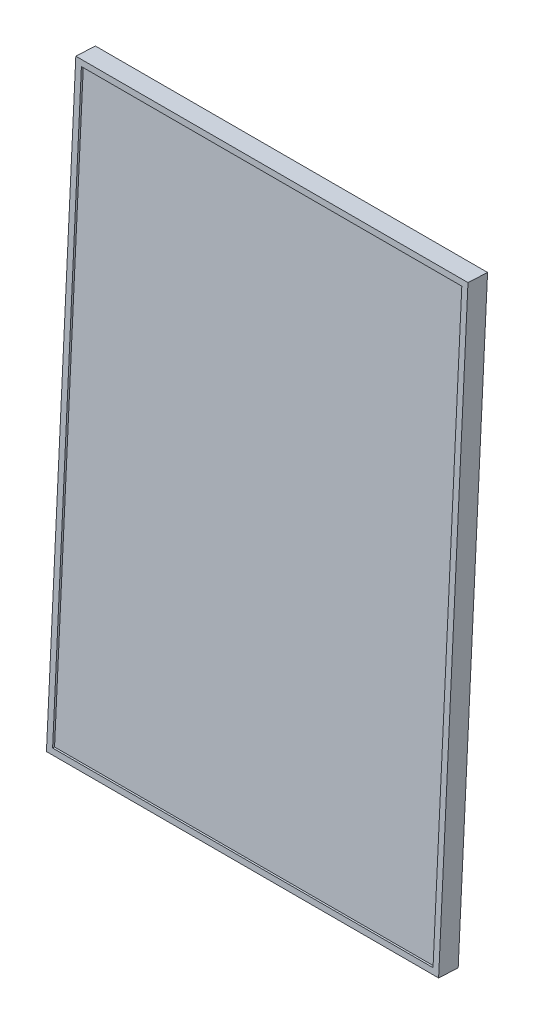
ISO-10303-21;
HEADER;
FILE_DESCRIPTION(('STEP AP214'),'2;1');
FILE_NAME('part.step','',(''),(''),'','','');
FILE_SCHEMA(('AUTOMOTIVE_DESIGN { 1 0 10303 214 1 1 1 1 }'));
ENDSEC;
DATA;
#1=APPLICATION_CONTEXT('core data for automotive mechanical design processes');
#2=APPLICATION_PROTOCOL_DEFINITION('international standard','automotive_design',2000,#1);
#3=PRODUCT_CONTEXT('',#1,'mechanical');
#4=PRODUCT('Part','Part','',(#3));
#5=PRODUCT_RELATED_PRODUCT_CATEGORY('part','',(#4));
#6=PRODUCT_DEFINITION_FORMATION('','',#4);
#7=PRODUCT_DEFINITION_CONTEXT('part definition',#1,'design');
#8=PRODUCT_DEFINITION('design','',#6,#7);
#9=PRODUCT_DEFINITION_SHAPE('','',#8);
#10=(LENGTH_UNIT() NAMED_UNIT(*) SI_UNIT(.MILLI.,.METRE.));
#11=(NAMED_UNIT(*) PLANE_ANGLE_UNIT() SI_UNIT($,.RADIAN.));
#12=(NAMED_UNIT(*) SI_UNIT($,.STERADIAN.) SOLID_ANGLE_UNIT());
#13=UNCERTAINTY_MEASURE_WITH_UNIT(LENGTH_MEASURE(1.E-05),#10,'distance_accuracy_value','');
#14=(GEOMETRIC_REPRESENTATION_CONTEXT(3) GLOBAL_UNCERTAINTY_ASSIGNED_CONTEXT((#13)) GLOBAL_UNIT_ASSIGNED_CONTEXT((#10,
#11,#12)) REPRESENTATION_CONTEXT('',''));
#15=CARTESIAN_POINT('',(0.,0.,0.));
#16=DIRECTION('',(0.,0.,1.));
#17=DIRECTION('',(1.,0.,0.));
#18=AXIS2_PLACEMENT_3D('',#15,#16,#17);
#19=CARTESIAN_POINT('',(-96.0427474368027,17.0060761486842,54.9032225890226));
#20=DIRECTION('',(-1.,0.,0.));
#21=DIRECTION('',(0.,0.,1.));
#22=AXIS2_PLACEMENT_3D('',#19,#20,#21);
#23=PLANE('',#22);
#24=DIRECTION('',(0.,0.0499376169438969,0.998752338877845));
#25=VECTOR('',#24,1.);
#26=CARTESIAN_POINT('',(-96.0427474368027,-282.619625514669,69.8845076721917));
#27=LINE('',#26,#25);
#28=CARTESIAN_POINT('',(-96.0427474368027,-282.619625514669,69.8845076721917));
#29=VERTEX_POINT('',#28);
#30=CARTESIAN_POINT('',(-96.0427474368027,-282.12024934523,79.8720310609701));
#31=VERTEX_POINT('',#30);
#32=EDGE_CURVE('E35',#29,#31,#27,.T.);
#33=ORIENTED_EDGE('',*,*,#32,.T.);
#34=DIRECTION('',(0.,-0.998752338877845,0.0499376169438969));
#35=VECTOR('',#34,1.);
#36=CARTESIAN_POINT('',(-96.0427474368027,17.5054523181232,64.8907459778011));
#37=LINE('',#36,#35);
#38=CARTESIAN_POINT('',(-96.0427474368027,17.5054523181232,64.8907459778011));
#39=VERTEX_POINT('',#38);
#40=EDGE_CURVE('E132',#39,#31,#37,.T.);
#41=ORIENTED_EDGE('',*,*,#40,.F.);
#42=DIRECTION('',(0.,0.0499376169438969,0.998752338877845));
#43=VECTOR('',#42,1.);
#44=CARTESIAN_POINT('',(-96.0427474368027,17.0060761486842,54.9032225890226));
#45=LINE('',#44,#43);
#46=CARTESIAN_POINT('',(-96.0427474368027,17.0060761486842,54.9032225890226));
#47=VERTEX_POINT('',#46);
#48=EDGE_CURVE('E11',#47,#39,#45,.T.);
#49=ORIENTED_EDGE('',*,*,#48,.F.);
#50=DIRECTION('',(0.,-0.998752338877845,0.0499376169438969));
#51=VECTOR('',#50,1.);
#52=CARTESIAN_POINT('',(-96.0427474368027,17.0060761486842,54.9032225890226));
#53=LINE('',#52,#51);
#54=EDGE_CURVE('E147',#47,#29,#53,.T.);
#55=ORIENTED_EDGE('',*,*,#54,.T.);
#56=EDGE_LOOP('',(#33,#41,#49,#55));
#57=FACE_BOUND('',#56,.T.);
#58=ADVANCED_FACE('F32',(#57),#23,.T.);
#59=CARTESIAN_POINT('',(-96.0427474368027,17.0060761486842,54.9032225890226));
#60=DIRECTION('',(0.,0.998752338877845,-0.0499376169438969));
#61=DIRECTION('',(0.,0.0499376169438969,0.998752338877845));
#62=AXIS2_PLACEMENT_3D('',#59,#60,#61);
#63=PLANE('',#62);
#64=ORIENTED_EDGE('',*,*,#48,.T.);
#65=DIRECTION('',(-1.,0.,0.));
#66=VECTOR('',#65,1.);
#67=CARTESIAN_POINT('',(-96.0427474368027,17.5054523181232,64.8907459778011));
#68=LINE('',#67,#66);
#69=CARTESIAN_POINT('',(103.957252563197,17.5054523181232,64.890745977801));
#70=VERTEX_POINT('',#69);
#71=EDGE_CURVE('E144',#70,#39,#68,.T.);
#72=ORIENTED_EDGE('',*,*,#71,.F.);
#73=DIRECTION('',(0.,0.0499376169438969,0.998752338877845));
#74=VECTOR('',#73,1.);
#75=CARTESIAN_POINT('',(103.957252563197,17.0060761486842,54.9032225890226));
#76=LINE('',#75,#74);
#77=CARTESIAN_POINT('',(103.957252563197,17.0060761486842,54.9032225890226));
#78=VERTEX_POINT('',#77);
#79=EDGE_CURVE('E40',#78,#70,#76,.T.);
#80=ORIENTED_EDGE('',*,*,#79,.F.);
#81=DIRECTION('',(-1.,0.,0.));
#82=VECTOR('',#81,1.);
#83=CARTESIAN_POINT('',(-96.0427474368027,17.0060761486842,54.9032225890226));
#84=LINE('',#83,#82);
#85=EDGE_CURVE('E155',#78,#47,#84,.T.);
#86=ORIENTED_EDGE('',*,*,#85,.T.);
#87=EDGE_LOOP('',(#64,#72,#80,#86));
#88=FACE_BOUND('',#87,.T.);
#89=ADVANCED_FACE('F168',(#88),#63,.T.);
#90=CARTESIAN_POINT('',(103.957252563197,17.0060761486842,54.9032225890226));
#91=DIRECTION('',(1.,0.,0.));
#92=DIRECTION('',(0.,0.,-1.));
#93=AXIS2_PLACEMENT_3D('',#90,#91,#92);
#94=PLANE('',#93);
#95=ORIENTED_EDGE('',*,*,#79,.T.);
#96=DIRECTION('',(0.,0.998752338877845,-0.0499376169438969));
#97=VECTOR('',#96,1.);
#98=CARTESIAN_POINT('',(103.957252563197,17.5054523181232,64.890745977801));
#99=LINE('',#98,#97);
#100=CARTESIAN_POINT('',(103.957252563197,-282.12024934523,79.8720310609701));
#101=VERTEX_POINT('',#100);
#102=EDGE_CURVE('E141',#101,#70,#99,.T.);
#103=ORIENTED_EDGE('',*,*,#102,.F.);
#104=DIRECTION('',(0.,0.0499376169438969,0.998752338877845));
#105=VECTOR('',#104,1.);
#106=CARTESIAN_POINT('',(103.957252563197,-282.619625514669,69.8845076721916));
#107=LINE('',#106,#105);
#108=CARTESIAN_POINT('',(103.957252563197,-282.619625514669,69.8845076721916));
#109=VERTEX_POINT('',#108);
#110=EDGE_CURVE('E158',#109,#101,#107,.T.);
#111=ORIENTED_EDGE('',*,*,#110,.F.);
#112=DIRECTION('',(0.,0.998752338877845,-0.0499376169438969));
#113=VECTOR('',#112,1.);
#114=CARTESIAN_POINT('',(103.957252563197,17.0060761486842,54.9032225890226));
#115=LINE('',#114,#113);
#116=EDGE_CURVE('E152',#109,#78,#115,.T.);
#117=ORIENTED_EDGE('',*,*,#116,.T.);
#118=EDGE_LOOP('',(#95,#103,#111,#117));
#119=FACE_BOUND('',#118,.T.);
#120=ADVANCED_FACE('F174',(#119),#94,.T.);
#121=CARTESIAN_POINT('',(-96.0427474368027,-282.619625514669,69.8845076721917));
#122=DIRECTION('',(0.,-0.998752338877845,0.0499376169438969));
#123=DIRECTION('',(0.,-0.0499376169438969,-0.998752338877845));
#124=AXIS2_PLACEMENT_3D('',#121,#122,#123);
#125=PLANE('',#124);
#126=ORIENTED_EDGE('',*,*,#110,.T.);
#127=DIRECTION('',(1.,0.,0.));
#128=VECTOR('',#127,1.);
#129=CARTESIAN_POINT('',(-96.0427474368027,-282.12024934523,79.8720310609701));
#130=LINE('',#129,#128);
#131=EDGE_CURVE('E138',#31,#101,#130,.T.);
#132=ORIENTED_EDGE('',*,*,#131,.F.);
#133=ORIENTED_EDGE('',*,*,#32,.F.);
#134=DIRECTION('',(1.,0.,0.));
#135=VECTOR('',#134,1.);
#136=CARTESIAN_POINT('',(-96.0427474368027,-282.619625514669,69.8845076721917));
#137=LINE('',#136,#135);
#138=EDGE_CURVE('E149',#29,#109,#137,.T.);
#139=ORIENTED_EDGE('',*,*,#138,.T.);
#140=EDGE_LOOP('',(#126,#132,#133,#139));
#141=FACE_BOUND('',#140,.T.);
#142=ADVANCED_FACE('F162',(#141),#125,.T.);
#143=CARTESIAN_POINT('',(0.,2.78072450855173,55.6144901710293));
#144=DIRECTION('',(0.,0.0499376169438969,0.998752338877845));
#145=DIRECTION('',(0.,-0.998752338877845,0.0499376169438969));
#146=AXIS2_PLACEMENT_3D('',#143,#144,#145);
#147=PLANE('',#146);
#148=ORIENTED_EDGE('',*,*,#54,.F.);
#149=ORIENTED_EDGE('',*,*,#85,.F.);
#150=ORIENTED_EDGE('',*,*,#116,.F.);
#151=ORIENTED_EDGE('',*,*,#138,.F.);
#152=EDGE_LOOP('',(#148,#149,#150,#151));
#153=FACE_BOUND('',#152,.T.);
#154=ADVANCED_FACE('F172',(#153),#147,.F.);
#155=CARTESIAN_POINT('',(0.,3.2801006779907,65.6020135598078));
#156=DIRECTION('',(0.,0.0499376169438969,0.998752338877845));
#157=DIRECTION('',(0.,-0.998752338877845,0.0499376169438969));
#158=AXIS2_PLACEMENT_3D('',#155,#156,#157);
#159=PLANE('',#158);
#160=DIRECTION('',(0.,0.998752338877844,-0.0499376169438969));
#161=VECTOR('',#160,1.);
#162=CARTESIAN_POINT('',(100.957252563197,-279.123992328597,79.7222182101384));
#163=LINE('',#162,#161);
#164=CARTESIAN_POINT('',(100.957252563197,-279.123992328597,79.7222182101384));
#165=VERTEX_POINT('',#164);
#166=CARTESIAN_POINT('',(100.957252563197,14.5091953014896,65.0405588286327));
#167=VERTEX_POINT('',#166);
#168=EDGE_CURVE('E48',#165,#167,#163,.T.);
#169=ORIENTED_EDGE('',*,*,#168,.F.);
#170=DIRECTION('',(1.,0.,0.));
#171=VECTOR('',#170,1.);
#172=CARTESIAN_POINT('',(100.957252563197,-279.123992328597,79.7222182101384));
#173=LINE('',#172,#171);
#174=CARTESIAN_POINT('',(-93.0427474368027,-279.123992328597,79.7222182101385));
#175=VERTEX_POINT('',#174);
#176=EDGE_CURVE('E117',#175,#165,#173,.T.);
#177=ORIENTED_EDGE('',*,*,#176,.F.);
#178=DIRECTION('',(0.,-0.998752338877844,0.0499376169438969));
#179=VECTOR('',#178,1.);
#180=CARTESIAN_POINT('',(-93.0427474368027,-279.123992328597,79.7222182101385));
#181=LINE('',#180,#179);
#182=CARTESIAN_POINT('',(-93.0427474368027,14.5091953014896,65.0405588286328));
#183=VERTEX_POINT('',#182);
#184=EDGE_CURVE('E120',#183,#175,#181,.T.);
#185=ORIENTED_EDGE('',*,*,#184,.F.);
#186=DIRECTION('',(-1.,0.,0.));
#187=VECTOR('',#186,1.);
#188=CARTESIAN_POINT('',(100.957252563197,14.5091953014896,65.0405588286327));
#189=LINE('',#188,#187);
#190=EDGE_CURVE('E126',#167,#183,#189,.T.);
#191=ORIENTED_EDGE('',*,*,#190,.F.);
#192=EDGE_LOOP('',(#169,#177,#185,#191));
#193=FACE_BOUND('',#192,.T.);
#194=ORIENTED_EDGE('',*,*,#40,.T.);
#195=ORIENTED_EDGE('',*,*,#131,.T.);
#196=ORIENTED_EDGE('',*,*,#102,.T.);
#197=ORIENTED_EDGE('',*,*,#71,.T.);
#198=EDGE_LOOP('',(#194,#195,#196,#197));
#199=FACE_BOUND('',#198,.T.);
#200=ADVANCED_FACE('F165',(#193,#199),#159,.T.);
#201=CARTESIAN_POINT('',(100.957252563197,-279.173929945541,78.7234658712606));
#202=DIRECTION('',(1.,0.,0.));
#203=DIRECTION('',(0.,0.,-1.));
#204=AXIS2_PLACEMENT_3D('',#201,#202,#203);
#205=PLANE('',#204);
#206=ORIENTED_EDGE('',*,*,#168,.T.);
#207=DIRECTION('',(0.,0.0499376169438969,0.998752338877845));
#208=VECTOR('',#207,1.);
#209=CARTESIAN_POINT('',(100.957252563197,14.4592576845457,64.0418064897549));
#210=LINE('',#209,#208);
#211=CARTESIAN_POINT('',(100.957252563197,14.4592576845457,64.0418064897549));
#212=VERTEX_POINT('',#211);
#213=EDGE_CURVE('E95',#212,#167,#210,.T.);
#214=ORIENTED_EDGE('',*,*,#213,.F.);
#215=DIRECTION('',(0.,0.998752338877844,-0.0499376169438969));
#216=VECTOR('',#215,1.);
#217=CARTESIAN_POINT('',(100.957252563197,-279.173929945541,78.7234658712606));
#218=LINE('',#217,#216);
#219=CARTESIAN_POINT('',(100.957252563197,-279.173929945541,78.7234658712606));
#220=VERTEX_POINT('',#219);
#221=EDGE_CURVE('E99',#220,#212,#218,.T.);
#222=ORIENTED_EDGE('',*,*,#221,.F.);
#223=DIRECTION('',(0.,0.0499376169438969,0.998752338877845));
#224=VECTOR('',#223,1.);
#225=CARTESIAN_POINT('',(100.957252563197,-279.173929945541,78.7234658712606));
#226=LINE('',#225,#224);
#227=EDGE_CURVE('E130',#220,#165,#226,.T.);
#228=ORIENTED_EDGE('',*,*,#227,.T.);
#229=EDGE_LOOP('',(#206,#214,#222,#228));
#230=FACE_BOUND('',#229,.T.);
#231=ADVANCED_FACE('F97',(#230),#205,.F.);
#232=CARTESIAN_POINT('',(100.957252563197,-279.173929945541,78.7234658712606));
#233=DIRECTION('',(0.,-0.998752338877845,0.0499376169438969));
#234=DIRECTION('',(0.,-0.0499376169438969,-0.998752338877845));
#235=AXIS2_PLACEMENT_3D('',#232,#233,#234);
#236=PLANE('',#235);
#237=ORIENTED_EDGE('',*,*,#176,.T.);
#238=ORIENTED_EDGE('',*,*,#227,.F.);
#239=DIRECTION('',(1.,0.,0.));
#240=VECTOR('',#239,1.);
#241=CARTESIAN_POINT('',(100.957252563197,-279.173929945541,78.7234658712606));
#242=LINE('',#241,#240);
#243=CARTESIAN_POINT('',(-93.0427474368027,-279.173929945541,78.7234658712606));
#244=VERTEX_POINT('',#243);
#245=EDGE_CURVE('E105',#244,#220,#242,.T.);
#246=ORIENTED_EDGE('',*,*,#245,.F.);
#247=DIRECTION('',(0.,0.0499376169438969,0.998752338877845));
#248=VECTOR('',#247,1.);
#249=CARTESIAN_POINT('',(-93.0427474368027,-279.173929945541,78.7234658712606));
#250=LINE('',#249,#248);
#251=EDGE_CURVE('E133',#244,#175,#250,.T.);
#252=ORIENTED_EDGE('',*,*,#251,.T.);
#253=EDGE_LOOP('',(#237,#238,#246,#252));
#254=FACE_BOUND('',#253,.T.);
#255=ADVANCED_FACE('F225',(#254),#236,.F.);
#256=CARTESIAN_POINT('',(-93.0427474368027,-279.173929945541,78.7234658712606));
#257=DIRECTION('',(-1.,0.,0.));
#258=DIRECTION('',(0.,0.,1.));
#259=AXIS2_PLACEMENT_3D('',#256,#257,#258);
#260=PLANE('',#259);
#261=ORIENTED_EDGE('',*,*,#184,.T.);
#262=ORIENTED_EDGE('',*,*,#251,.F.);
#263=DIRECTION('',(0.,-0.998752338877844,0.0499376169438969));
#264=VECTOR('',#263,1.);
#265=CARTESIAN_POINT('',(-93.0427474368027,-279.173929945541,78.7234658712606));
#266=LINE('',#265,#264);
#267=CARTESIAN_POINT('',(-93.0427474368027,14.4592576845457,64.0418064897549));
#268=VERTEX_POINT('',#267);
#269=EDGE_CURVE('E113',#268,#244,#266,.T.);
#270=ORIENTED_EDGE('',*,*,#269,.F.);
#271=DIRECTION('',(0.,0.0499376169438969,0.998752338877845));
#272=VECTOR('',#271,1.);
#273=CARTESIAN_POINT('',(-93.0427474368027,14.4592576845457,64.0418064897549));
#274=LINE('',#273,#272);
#275=EDGE_CURVE('E104',#268,#183,#274,.T.);
#276=ORIENTED_EDGE('',*,*,#275,.T.);
#277=EDGE_LOOP('',(#261,#262,#270,#276));
#278=FACE_BOUND('',#277,.T.);
#279=ADVANCED_FACE('F234',(#278),#260,.F.);
#280=CARTESIAN_POINT('',(100.957252563197,14.4592576845457,64.0418064897549));
#281=DIRECTION('',(0.,0.998752338877845,-0.0499376169438969));
#282=DIRECTION('',(0.,0.0499376169438969,0.998752338877845));
#283=AXIS2_PLACEMENT_3D('',#280,#281,#282);
#284=PLANE('',#283);
#285=ORIENTED_EDGE('',*,*,#190,.T.);
#286=ORIENTED_EDGE('',*,*,#275,.F.);
#287=DIRECTION('',(-1.,0.,0.));
#288=VECTOR('',#287,1.);
#289=CARTESIAN_POINT('',(100.957252563197,14.4592576845457,64.0418064897549));
#290=LINE('',#289,#288);
#291=EDGE_CURVE('E108',#212,#268,#290,.T.);
#292=ORIENTED_EDGE('',*,*,#291,.F.);
#293=ORIENTED_EDGE('',*,*,#213,.T.);
#294=EDGE_LOOP('',(#285,#286,#292,#293));
#295=FACE_BOUND('',#294,.T.);
#296=ADVANCED_FACE('F109',(#295),#284,.F.);
#297=CARTESIAN_POINT('',(0.,3.2301630610468,64.6032612209299));
#298=DIRECTION('',(0.,0.0499376169438969,0.998752338877845));
#299=DIRECTION('',(0.,-0.998752338877845,0.0499376169438969));
#300=AXIS2_PLACEMENT_3D('',#297,#298,#299);
#301=PLANE('',#300);
#302=ORIENTED_EDGE('',*,*,#221,.T.);
#303=ORIENTED_EDGE('',*,*,#291,.T.);
#304=ORIENTED_EDGE('',*,*,#269,.T.);
#305=ORIENTED_EDGE('',*,*,#245,.T.);
#306=EDGE_LOOP('',(#302,#303,#304,#305));
#307=FACE_BOUND('',#306,.T.);
#308=ADVANCED_FACE('F115',(#307),#301,.T.);
#309=CLOSED_SHELL('',(#58,#89,#120,#142,#154,#200,#231,#255,#279,#296,#308));
#310=MANIFOLD_SOLID_BREP('B2',#309);
#311=ADVANCED_BREP_SHAPE_REPRESENTATION('',(#18,#310),#14);
#312=SHAPE_DEFINITION_REPRESENTATION(#9,#311);
ENDSEC;
END-ISO-10303-21;
